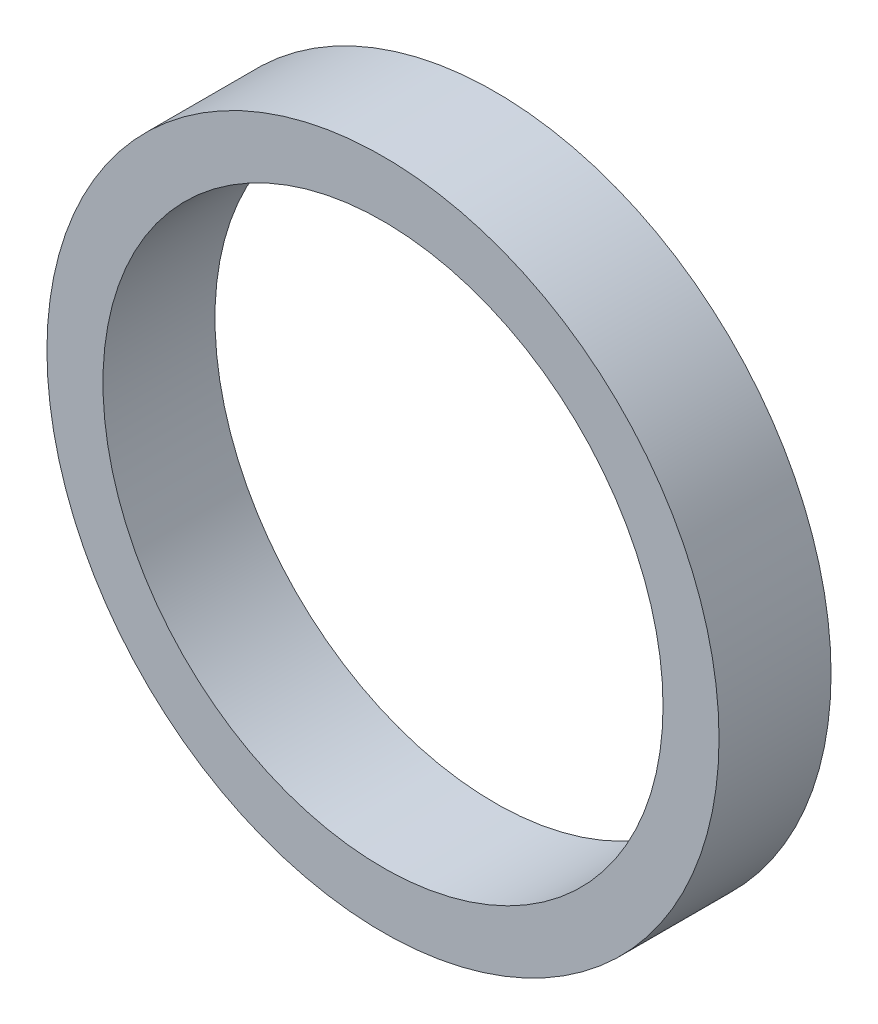
ISO-10303-21;
HEADER;
FILE_DESCRIPTION(('STEP AP214'),'2;1');
FILE_NAME('part.step','',(''),(''),'','','');
FILE_SCHEMA(('AUTOMOTIVE_DESIGN { 1 0 10303 214 1 1 1 1 }'));
ENDSEC;
DATA;
#1=APPLICATION_CONTEXT('core data for automotive mechanical design processes');
#2=APPLICATION_PROTOCOL_DEFINITION('international standard','automotive_design',2000,#1);
#3=PRODUCT_CONTEXT('',#1,'mechanical');
#4=PRODUCT('Part','Part','',(#3));
#5=PRODUCT_RELATED_PRODUCT_CATEGORY('part','',(#4));
#6=PRODUCT_DEFINITION_FORMATION('','',#4);
#7=PRODUCT_DEFINITION_CONTEXT('part definition',#1,'design');
#8=PRODUCT_DEFINITION('design','',#6,#7);
#9=PRODUCT_DEFINITION_SHAPE('','',#8);
#10=(LENGTH_UNIT() NAMED_UNIT(*) SI_UNIT(.MILLI.,.METRE.));
#11=(NAMED_UNIT(*) PLANE_ANGLE_UNIT() SI_UNIT($,.RADIAN.));
#12=(NAMED_UNIT(*) SI_UNIT($,.STERADIAN.) SOLID_ANGLE_UNIT());
#13=UNCERTAINTY_MEASURE_WITH_UNIT(LENGTH_MEASURE(1.E-05),#10,'distance_accuracy_value','');
#14=(GEOMETRIC_REPRESENTATION_CONTEXT(3) GLOBAL_UNCERTAINTY_ASSIGNED_CONTEXT((#13)) GLOBAL_UNIT_ASSIGNED_CONTEXT((#10,
#11,#12)) REPRESENTATION_CONTEXT('',''));
#15=CARTESIAN_POINT('',(0.,0.,0.));
#16=DIRECTION('',(0.,0.,1.));
#17=DIRECTION('',(1.,0.,0.));
#18=AXIS2_PLACEMENT_3D('',#15,#16,#17);
#19=CARTESIAN_POINT('',(0.,0.,8.));
#20=DIRECTION('',(0.,0.,1.));
#21=DIRECTION('',(1.,0.,0.));
#22=AXIS2_PLACEMENT_3D('',#19,#20,#21);
#23=PLANE('',#22);
#24=CARTESIAN_POINT('',(0.,0.,8.));
#25=DIRECTION('',(0.,0.,1.));
#26=DIRECTION('',(1.,0.,0.));
#27=AXIS2_PLACEMENT_3D('',#24,#25,#26);
#28=CIRCLE('',#27,24.);
#29=CARTESIAN_POINT('',(24.,0.,8.));
#30=VERTEX_POINT('',#29);
#31=EDGE_CURVE('E10',#30,#30,#28,.T.);
#32=ORIENTED_EDGE('',*,*,#31,.T.);
#33=EDGE_LOOP('',(#32));
#34=FACE_BOUND('',#33,.T.);
#35=CARTESIAN_POINT('',(0.,0.,8.));
#36=DIRECTION('',(0.,0.,1.));
#37=DIRECTION('',(1.,0.,0.));
#38=AXIS2_PLACEMENT_3D('',#35,#36,#37);
#39=CIRCLE('',#38,20.);
#40=CARTESIAN_POINT('',(20.,0.,8.));
#41=VERTEX_POINT('',#40);
#42=EDGE_CURVE('E56',#41,#41,#39,.T.);
#43=ORIENTED_EDGE('',*,*,#42,.F.);
#44=EDGE_LOOP('',(#43));
#45=FACE_BOUND('',#44,.T.);
#46=ADVANCED_FACE('F43',(#34,#45),#23,.T.);
#47=CARTESIAN_POINT('',(0.,0.,0.));
#48=DIRECTION('',(0.,0.,1.));
#49=DIRECTION('',(1.,0.,0.));
#50=AXIS2_PLACEMENT_3D('',#47,#48,#49);
#51=PLANE('',#50);
#52=CARTESIAN_POINT('',(0.,0.,0.));
#53=DIRECTION('',(0.,0.,1.));
#54=DIRECTION('',(1.,0.,0.));
#55=AXIS2_PLACEMENT_3D('',#52,#53,#54);
#56=CIRCLE('',#55,24.);
#57=CARTESIAN_POINT('',(24.,0.,0.));
#58=VERTEX_POINT('',#57);
#59=EDGE_CURVE('E47',#58,#58,#56,.T.);
#60=ORIENTED_EDGE('',*,*,#59,.F.);
#61=EDGE_LOOP('',(#60));
#62=FACE_BOUND('',#61,.T.);
#63=CARTESIAN_POINT('',(0.,0.,0.));
#64=DIRECTION('',(0.,0.,1.));
#65=DIRECTION('',(1.,0.,0.));
#66=AXIS2_PLACEMENT_3D('',#63,#64,#65);
#67=CIRCLE('',#66,20.);
#68=CARTESIAN_POINT('',(20.,0.,0.));
#69=VERTEX_POINT('',#68);
#70=EDGE_CURVE('E58',#69,#69,#67,.T.);
#71=ORIENTED_EDGE('',*,*,#70,.T.);
#72=EDGE_LOOP('',(#71));
#73=FACE_BOUND('',#72,.T.);
#74=ADVANCED_FACE('F70',(#62,#73),#51,.F.);
#75=CARTESIAN_POINT('',(0.,0.,8.));
#76=DIRECTION('',(0.,0.,-1.));
#77=DIRECTION('',(-1.,0.,0.));
#78=AXIS2_PLACEMENT_3D('',#75,#76,#77);
#79=CYLINDRICAL_SURFACE('',#78,24.);
#80=ORIENTED_EDGE('',*,*,#31,.F.);
#81=EDGE_LOOP('',(#80));
#82=FACE_BOUND('',#81,.T.);
#83=ORIENTED_EDGE('',*,*,#59,.T.);
#84=EDGE_LOOP('',(#83));
#85=FACE_BOUND('',#84,.T.);
#86=ADVANCED_FACE('F45',(#82,#85),#79,.T.);
#87=CARTESIAN_POINT('',(0.,0.,8.));
#88=DIRECTION('',(0.,0.,-1.));
#89=DIRECTION('',(-1.,0.,0.));
#90=AXIS2_PLACEMENT_3D('',#87,#88,#89);
#91=CYLINDRICAL_SURFACE('',#90,20.);
#92=ORIENTED_EDGE('',*,*,#42,.T.);
#93=EDGE_LOOP('',(#92));
#94=FACE_BOUND('',#93,.T.);
#95=ORIENTED_EDGE('',*,*,#70,.F.);
#96=EDGE_LOOP('',(#95));
#97=FACE_BOUND('',#96,.T.);
#98=ADVANCED_FACE('F66',(#94,#97),#91,.F.);
#99=CLOSED_SHELL('',(#46,#74,#86,#98));
#100=MANIFOLD_SOLID_BREP('B2',#99);
#101=ADVANCED_BREP_SHAPE_REPRESENTATION('',(#18,#100),#14);
#102=SHAPE_DEFINITION_REPRESENTATION(#9,#101);
ENDSEC;
END-ISO-10303-21;
